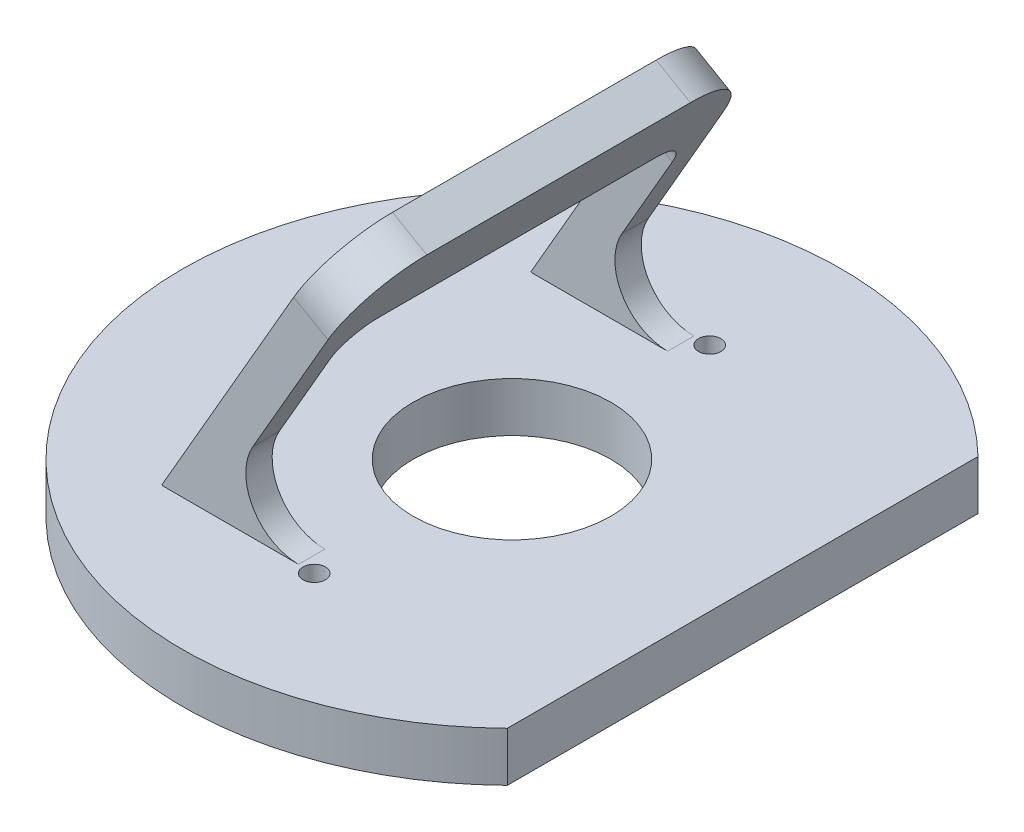
ISO-10303-21;
HEADER;
FILE_DESCRIPTION(('STEP AP214'),'2;1');
FILE_NAME('part.step','',(''),(''),'','','');
FILE_SCHEMA(('AUTOMOTIVE_DESIGN { 1 0 10303 214 1 1 1 1 }'));
ENDSEC;
DATA;
#1=APPLICATION_CONTEXT('core data for automotive mechanical design processes');
#2=APPLICATION_PROTOCOL_DEFINITION('international standard','automotive_design',2000,#1);
#3=PRODUCT_CONTEXT('',#1,'mechanical');
#4=PRODUCT('Part','Part','',(#3));
#5=PRODUCT_RELATED_PRODUCT_CATEGORY('part','',(#4));
#6=PRODUCT_DEFINITION_FORMATION('','',#4);
#7=PRODUCT_DEFINITION_CONTEXT('part definition',#1,'design');
#8=PRODUCT_DEFINITION('design','',#6,#7);
#9=PRODUCT_DEFINITION_SHAPE('','',#8);
#10=(LENGTH_UNIT() NAMED_UNIT(*) SI_UNIT(.MILLI.,.METRE.));
#11=(NAMED_UNIT(*) PLANE_ANGLE_UNIT() SI_UNIT($,.RADIAN.));
#12=(NAMED_UNIT(*) SI_UNIT($,.STERADIAN.) SOLID_ANGLE_UNIT());
#13=UNCERTAINTY_MEASURE_WITH_UNIT(LENGTH_MEASURE(1.E-05),#10,'distance_accuracy_value','');
#14=(GEOMETRIC_REPRESENTATION_CONTEXT(3) GLOBAL_UNCERTAINTY_ASSIGNED_CONTEXT((#13)) GLOBAL_UNIT_ASSIGNED_CONTEXT((#10,
#11,#12)) REPRESENTATION_CONTEXT('',''));
#15=CARTESIAN_POINT('',(0.,0.,0.));
#16=DIRECTION('',(0.,0.,1.));
#17=DIRECTION('',(1.,0.,0.));
#18=AXIS2_PLACEMENT_3D('',#15,#16,#17);
#19=CARTESIAN_POINT('',(0.,15.,0.));
#20=DIRECTION('',(0.,1.,0.));
#21=DIRECTION('',(0.,0.,1.));
#22=AXIS2_PLACEMENT_3D('',#19,#20,#21);
#23=PLANE('',#22);
#24=CARTESIAN_POINT('',(-6.28466640991764E-13,15.,-60.));
#25=DIRECTION('',(0.,1.,0.));
#26=DIRECTION('',(0.,0.,1.));
#27=AXIS2_PLACEMENT_3D('',#24,#25,#26);
#28=CIRCLE('',#27,3.39999999999999);
#29=CARTESIAN_POINT('',(-6.28466640991764E-13,15.,-56.6));
#30=VERTEX_POINT('',#29);
#31=EDGE_CURVE('E483',#30,#30,#28,.T.);
#32=ORIENTED_EDGE('',*,*,#31,.F.);
#33=EDGE_LOOP('',(#32));
#34=FACE_BOUND('',#33,.T.);
#35=CARTESIAN_POINT('',(2.09488880330588E-13,15.,60.));
#36=DIRECTION('',(0.,1.,0.));
#37=DIRECTION('',(0.,0.,1.));
#38=AXIS2_PLACEMENT_3D('',#35,#36,#37);
#39=CIRCLE('',#38,3.39999999999999);
#40=CARTESIAN_POINT('',(2.09488880330588E-13,15.,63.4));
#41=VERTEX_POINT('',#40);
#42=EDGE_CURVE('E487',#41,#41,#39,.T.);
#43=ORIENTED_EDGE('',*,*,#42,.F.);
#44=EDGE_LOOP('',(#43));
#45=FACE_BOUND('',#44,.T.);
#46=CARTESIAN_POINT('',(-60.,15.,0.));
#47=DIRECTION('',(0.,1.,0.));
#48=DIRECTION('',(0.,0.,1.));
#49=AXIS2_PLACEMENT_3D('',#46,#47,#48);
#50=CIRCLE('',#49,3.39999999999999);
#51=CARTESIAN_POINT('',(-60.,15.,3.39999999999999));
#52=VERTEX_POINT('',#51);
#53=EDGE_CURVE('E497',#52,#52,#50,.T.);
#54=ORIENTED_EDGE('',*,*,#53,.F.);
#55=EDGE_LOOP('',(#54));
#56=FACE_BOUND('',#55,.T.);
#57=DIRECTION('',(-1.,0.,0.));
#58=VECTOR('',#57,1.);
#59=CARTESIAN_POINT('',(0.,15.,52.));
#60=LINE('',#59,#58);
#61=CARTESIAN_POINT('',(-4.7705265805027,15.,52.));
#62=VERTEX_POINT('',#61);
#63=CARTESIAN_POINT('',(-45.9404015731476,15.,52.));
#64=VERTEX_POINT('',#63);
#65=EDGE_CURVE('E342',#62,#64,#60,.T.);
#66=ORIENTED_EDGE('',*,*,#65,.F.);
#67=DIRECTION('',(0.,0.,-1.));
#68=VECTOR('',#67,1.);
#69=CARTESIAN_POINT('',(-4.7705265805027,15.,60.));
#70=LINE('',#69,#68);
#71=CARTESIAN_POINT('',(-4.7705265805027,15.,60.));
#72=VERTEX_POINT('',#71);
#73=EDGE_CURVE('E360',#62,#72,#70,.F.);
#74=ORIENTED_EDGE('',*,*,#73,.T.);
#75=DIRECTION('',(1.,0.,0.));
#76=VECTOR('',#75,1.);
#77=CARTESIAN_POINT('',(0.,15.,60.));
#78=LINE('',#77,#76);
#79=CARTESIAN_POINT('',(-45.9404015731476,15.,60.));
#80=VERTEX_POINT('',#79);
#81=EDGE_CURVE('E350',#80,#72,#78,.T.);
#82=ORIENTED_EDGE('',*,*,#81,.F.);
#83=DIRECTION('',(0.,0.,1.));
#84=VECTOR('',#83,1.);
#85=CARTESIAN_POINT('',(-45.9404015731476,15.,0.));
#86=LINE('',#85,#84);
#87=EDGE_CURVE('E346',#64,#80,#86,.T.);
#88=ORIENTED_EDGE('',*,*,#87,.F.);
#89=EDGE_LOOP('',(#66,#74,#82,#88));
#90=FACE_BOUND('',#89,.T.);
#91=DIRECTION('',(-1.,0.,0.));
#92=VECTOR('',#91,1.);
#93=CARTESIAN_POINT('',(0.,15.,-60.));
#94=LINE('',#93,#92);
#95=CARTESIAN_POINT('',(-4.77052658050271,15.,-60.));
#96=VERTEX_POINT('',#95);
#97=CARTESIAN_POINT('',(-45.9404015731476,15.,-60.));
#98=VERTEX_POINT('',#97);
#99=EDGE_CURVE('E57',#96,#98,#94,.T.);
#100=ORIENTED_EDGE('',*,*,#99,.F.);
#101=DIRECTION('',(0.,0.,-1.));
#102=VECTOR('',#101,1.);
#103=CARTESIAN_POINT('',(-4.77052658050271,15.,-52.));
#104=LINE('',#103,#102);
#105=CARTESIAN_POINT('',(-4.77052658050271,15.,-52.));
#106=VERTEX_POINT('',#105);
#107=EDGE_CURVE('E364',#96,#106,#104,.F.);
#108=ORIENTED_EDGE('',*,*,#107,.T.);
#109=DIRECTION('',(1.,0.,0.));
#110=VECTOR('',#109,1.);
#111=CARTESIAN_POINT('',(0.,15.,-52.));
#112=LINE('',#111,#110);
#113=CARTESIAN_POINT('',(-45.9404015731476,15.,-52.));
#114=VERTEX_POINT('',#113);
#115=EDGE_CURVE('E65',#114,#106,#112,.T.);
#116=ORIENTED_EDGE('',*,*,#115,.F.);
#117=DIRECTION('',(0.,0.,1.));
#118=VECTOR('',#117,1.);
#119=CARTESIAN_POINT('',(-45.9404015731476,15.,0.));
#120=LINE('',#119,#118);
#121=EDGE_CURVE('E338',#98,#114,#120,.T.);
#122=ORIENTED_EDGE('',*,*,#121,.F.);
#123=EDGE_LOOP('',(#100,#108,#116,#122));
#124=FACE_BOUND('',#123,.T.);
#125=CARTESIAN_POINT('',(0.,15.,0.));
#126=DIRECTION('',(0.,1.,0.));
#127=DIRECTION('',(0.,0.,1.));
#128=AXIS2_PLACEMENT_3D('',#125,#126,#127);
#129=CIRCLE('',#128,100.);
#130=CARTESIAN_POINT('',(70.,15.,-71.4142842854285));
#131=VERTEX_POINT('',#130);
#132=CARTESIAN_POINT('',(70.,15.,71.4142842854285));
#133=VERTEX_POINT('',#132);
#134=EDGE_CURVE('E313',#131,#133,#129,.T.);
#135=ORIENTED_EDGE('',*,*,#134,.T.);
#136=DIRECTION('',(0.,0.,-1.));
#137=VECTOR('',#136,1.);
#138=CARTESIAN_POINT('',(70.,15.,-71.4142842854285));
#139=LINE('',#138,#137);
#140=EDGE_CURVE('E317',#133,#131,#139,.T.);
#141=ORIENTED_EDGE('',*,*,#140,.T.);
#142=EDGE_LOOP('',(#135,#141));
#143=FACE_BOUND('',#142,.T.);
#144=CARTESIAN_POINT('',(0.,15.,0.));
#145=DIRECTION('',(0.,1.,0.));
#146=DIRECTION('',(0.,0.,1.));
#147=AXIS2_PLACEMENT_3D('',#144,#145,#146);
#148=CIRCLE('',#147,30.);
#149=CARTESIAN_POINT('',(0.,15.,30.));
#150=VERTEX_POINT('',#149);
#151=EDGE_CURVE('E305',#150,#150,#148,.T.);
#152=ORIENTED_EDGE('',*,*,#151,.F.);
#153=EDGE_LOOP('',(#152));
#154=FACE_BOUND('',#153,.T.);
#155=ADVANCED_FACE('F41',(#34,#45,#56,#90,#124,#143,#154),#23,.T.);
#156=CARTESIAN_POINT('',(0.,0.,0.));
#157=DIRECTION('',(0.,1.,0.));
#158=DIRECTION('',(0.,0.,1.));
#159=AXIS2_PLACEMENT_3D('',#156,#157,#158);
#160=PLANE('',#159);
#161=CARTESIAN_POINT('',(-6.28466640991764E-13,0.,-60.));
#162=DIRECTION('',(0.,1.,0.));
#163=DIRECTION('',(0.,0.,1.));
#164=AXIS2_PLACEMENT_3D('',#161,#162,#163);
#165=CIRCLE('',#164,3.39999999999999);
#166=CARTESIAN_POINT('',(-6.28466640991764E-13,0.,-56.6));
#167=VERTEX_POINT('',#166);
#168=EDGE_CURVE('E481',#167,#167,#165,.T.);
#169=ORIENTED_EDGE('',*,*,#168,.T.);
#170=EDGE_LOOP('',(#169));
#171=FACE_BOUND('',#170,.T.);
#172=CARTESIAN_POINT('',(2.09488880330588E-13,0.,60.));
#173=DIRECTION('',(0.,1.,0.));
#174=DIRECTION('',(0.,0.,1.));
#175=AXIS2_PLACEMENT_3D('',#172,#173,#174);
#176=CIRCLE('',#175,3.39999999999999);
#177=CARTESIAN_POINT('',(2.09488880330588E-13,0.,63.4));
#178=VERTEX_POINT('',#177);
#179=EDGE_CURVE('E493',#178,#178,#176,.T.);
#180=ORIENTED_EDGE('',*,*,#179,.T.);
#181=EDGE_LOOP('',(#180));
#182=FACE_BOUND('',#181,.T.);
#183=CARTESIAN_POINT('',(-60.,0.,0.));
#184=DIRECTION('',(0.,1.,0.));
#185=DIRECTION('',(0.,0.,1.));
#186=AXIS2_PLACEMENT_3D('',#183,#184,#185);
#187=CIRCLE('',#186,3.39999999999999);
#188=CARTESIAN_POINT('',(-60.,0.,3.39999999999999));
#189=VERTEX_POINT('',#188);
#190=EDGE_CURVE('E233',#189,#189,#187,.T.);
#191=ORIENTED_EDGE('',*,*,#190,.T.);
#192=EDGE_LOOP('',(#191));
#193=FACE_BOUND('',#192,.T.);
#194=CARTESIAN_POINT('',(0.,0.,0.));
#195=DIRECTION('',(0.,1.,0.));
#196=DIRECTION('',(0.,0.,1.));
#197=AXIS2_PLACEMENT_3D('',#194,#195,#196);
#198=CIRCLE('',#197,100.);
#199=CARTESIAN_POINT('',(70.,0.,-71.4142842854285));
#200=VERTEX_POINT('',#199);
#201=CARTESIAN_POINT('',(70.,0.,71.4142842854285));
#202=VERTEX_POINT('',#201);
#203=EDGE_CURVE('E309',#200,#202,#198,.T.);
#204=ORIENTED_EDGE('',*,*,#203,.F.);
#205=DIRECTION('',(0.,0.,-1.));
#206=VECTOR('',#205,1.);
#207=CARTESIAN_POINT('',(70.,0.,-71.4142842854285));
#208=LINE('',#207,#206);
#209=EDGE_CURVE('E318',#202,#200,#208,.T.);
#210=ORIENTED_EDGE('',*,*,#209,.F.);
#211=EDGE_LOOP('',(#204,#210));
#212=FACE_BOUND('',#211,.T.);
#213=CARTESIAN_POINT('',(0.,0.,0.));
#214=DIRECTION('',(0.,1.,0.));
#215=DIRECTION('',(0.,0.,1.));
#216=AXIS2_PLACEMENT_3D('',#213,#214,#215);
#217=CIRCLE('',#216,30.);
#218=CARTESIAN_POINT('',(0.,0.,30.));
#219=VERTEX_POINT('',#218);
#220=EDGE_CURVE('E276',#219,#219,#217,.T.);
#221=ORIENTED_EDGE('',*,*,#220,.T.);
#222=EDGE_LOOP('',(#221));
#223=FACE_BOUND('',#222,.T.);
#224=ADVANCED_FACE('F433',(#171,#182,#193,#212,#223),#160,.F.);
#225=CARTESIAN_POINT('',(0.,15.,0.));
#226=DIRECTION('',(0.,-1.,0.));
#227=DIRECTION('',(0.,0.,-1.));
#228=AXIS2_PLACEMENT_3D('',#225,#226,#227);
#229=CYLINDRICAL_SURFACE('',#228,100.);
#230=ORIENTED_EDGE('',*,*,#203,.T.);
#231=DIRECTION('',(0.,-1.,0.));
#232=VECTOR('',#231,1.);
#233=CARTESIAN_POINT('',(70.,15.,71.4142842854285));
#234=LINE('',#233,#232);
#235=EDGE_CURVE('E330',#133,#202,#234,.T.);
#236=ORIENTED_EDGE('',*,*,#235,.F.);
#237=ORIENTED_EDGE('',*,*,#134,.F.);
#238=DIRECTION('',(0.,-1.,0.));
#239=VECTOR('',#238,1.);
#240=CARTESIAN_POINT('',(70.,15.,-71.4142842854285));
#241=LINE('',#240,#239);
#242=EDGE_CURVE('E321',#131,#200,#241,.T.);
#243=ORIENTED_EDGE('',*,*,#242,.T.);
#244=EDGE_LOOP('',(#230,#236,#237,#243));
#245=FACE_BOUND('',#244,.T.);
#246=ADVANCED_FACE('F439',(#245),#229,.T.);
#247=CARTESIAN_POINT('',(70.,15.,-71.4142842854285));
#248=DIRECTION('',(-1.,0.,0.));
#249=DIRECTION('',(0.,0.,1.));
#250=AXIS2_PLACEMENT_3D('',#247,#248,#249);
#251=PLANE('',#250);
#252=ORIENTED_EDGE('',*,*,#209,.T.);
#253=ORIENTED_EDGE('',*,*,#242,.F.);
#254=ORIENTED_EDGE('',*,*,#140,.F.);
#255=ORIENTED_EDGE('',*,*,#235,.T.);
#256=EDGE_LOOP('',(#252,#253,#254,#255));
#257=FACE_BOUND('',#256,.T.);
#258=ADVANCED_FACE('F448',(#257),#251,.F.);
#259=CARTESIAN_POINT('',(0.,15.,0.));
#260=DIRECTION('',(0.,-1.,0.));
#261=DIRECTION('',(0.,0.,-1.));
#262=AXIS2_PLACEMENT_3D('',#259,#260,#261);
#263=CYLINDRICAL_SURFACE('',#262,30.);
#264=ORIENTED_EDGE('',*,*,#151,.T.);
#265=EDGE_LOOP('',(#264));
#266=FACE_BOUND('',#265,.T.);
#267=ORIENTED_EDGE('',*,*,#220,.F.);
#268=EDGE_LOOP('',(#267));
#269=FACE_BOUND('',#268,.T.);
#270=ADVANCED_FACE('F445',(#266,#269),#263,.F.);
#271=CARTESIAN_POINT('',(-35.8476050194904,9.17292119286991,-60.));
#272=DIRECTION('',(-0.499999999999998,-0.86602540378444,0.));
#273=DIRECTION('',(0.86602540378444,-0.499999999999998,0.));
#274=AXIS2_PLACEMENT_3D('',#271,#272,#273);
#275=PLANE('',#274);
#276=DIRECTION('',(-0.86602540378444,0.499999999999998,0.));
#277=VECTOR('',#276,1.);
#278=CARTESIAN_POINT('',(-35.8476050194904,9.17292119286991,-60.));
#279=LINE('',#278,#277);
#280=CARTESIAN_POINT('',(-46.2399098649037,15.1729211928699,-60.));
#281=VERTEX_POINT('',#280);
#282=EDGE_CURVE('E273',#98,#281,#279,.T.);
#283=ORIENTED_EDGE('',*,*,#282,.F.);
#284=ORIENTED_EDGE('',*,*,#121,.T.);
#285=DIRECTION('',(-0.86602540378444,0.499999999999998,0.));
#286=VECTOR('',#285,1.);
#287=CARTESIAN_POINT('',(-35.8476050194904,9.17292119286991,-52.));
#288=LINE('',#287,#286);
#289=CARTESIAN_POINT('',(-46.2399098649037,15.1729211928699,-52.));
#290=VERTEX_POINT('',#289);
#291=EDGE_CURVE('E188',#114,#290,#288,.T.);
#292=ORIENTED_EDGE('',*,*,#291,.T.);
#293=DIRECTION('',(0.,0.,1.));
#294=VECTOR('',#293,1.);
#295=CARTESIAN_POINT('',(-46.2399098649037,15.1729211928699,-60.));
#296=LINE('',#295,#294);
#297=EDGE_CURVE('E228',#281,#290,#296,.T.);
#298=ORIENTED_EDGE('',*,*,#297,.F.);
#299=EDGE_LOOP('',(#283,#284,#292,#298));
#300=FACE_BOUND('',#299,.T.);
#301=ADVANCED_FACE('F404',(#300),#275,.T.);
#302=CARTESIAN_POINT('',(-35.8476050194904,9.17292119286991,-60.));
#303=DIRECTION('',(0.,0.,-1.));
#304=DIRECTION('',(-1.,0.,0.));
#305=AXIS2_PLACEMENT_3D('',#302,#303,#304);
#306=PLANE('',#305);
#307=DIRECTION('',(-0.499999999999998,-0.86602540378444,0.));
#308=VECTOR('',#307,1.);
#309=CARTESIAN_POINT('',(-35.8476050194904,9.17292119286991,-60.));
#310=LINE('',#309,#308);
#311=CARTESIAN_POINT('',(4.1523949805094,78.454953495625,-60.));
#312=VERTEX_POINT('',#311);
#313=CARTESIAN_POINT('',(-18.6269330410537,39.,-60.));
#314=VERTEX_POINT('',#313);
#315=EDGE_CURVE('E224',#312,#314,#310,.T.);
#316=ORIENTED_EDGE('',*,*,#315,.T.);
#317=CARTESIAN_POINT('',(-4.77052658050271,31.,-60.));
#318=DIRECTION('',(0.,0.,-1.));
#319=DIRECTION('',(-1.,0.,0.));
#320=AXIS2_PLACEMENT_3D('',#317,#318,#319);
#321=CIRCLE('',#320,16.);
#322=EDGE_CURVE('E367',#314,#96,#321,.F.);
#323=ORIENTED_EDGE('',*,*,#322,.T.);
#324=ORIENTED_EDGE('',*,*,#99,.T.);
#325=ORIENTED_EDGE('',*,*,#282,.T.);
#326=DIRECTION('',(-0.499999999999998,-0.86602540378444,0.));
#327=VECTOR('',#326,1.);
#328=CARTESIAN_POINT('',(-46.2399098649037,15.1729211928699,-60.));
#329=LINE('',#328,#327);
#330=CARTESIAN_POINT('',(-6.23990986490388,84.454953495625,-60.));
#331=VERTEX_POINT('',#330);
#332=EDGE_CURVE('E178',#331,#281,#329,.T.);
#333=ORIENTED_EDGE('',*,*,#332,.F.);
#334=DIRECTION('',(-0.86602540378444,0.499999999999998,0.));
#335=VECTOR('',#334,1.);
#336=CARTESIAN_POINT('',(4.1523949805094,78.454953495625,-60.));
#337=LINE('',#336,#335);
#338=EDGE_CURVE('E277',#312,#331,#337,.T.);
#339=ORIENTED_EDGE('',*,*,#338,.F.);
#340=EDGE_LOOP('',(#316,#323,#324,#325,#333,#339));
#341=FACE_BOUND('',#340,.T.);
#342=ADVANCED_FACE('F407',(#341),#306,.T.);
#343=CARTESIAN_POINT('',(4.15239498050947,78.4549534956251,-40.));
#344=DIRECTION('',(-0.86602540378444,0.499999999999998,0.));
#345=DIRECTION('',(-0.499999999999998,-0.86602540378444,0.));
#346=AXIS2_PLACEMENT_3D('',#343,#344,#345);
#347=CYLINDRICAL_SURFACE('',#346,20.);
#348=CARTESIAN_POINT('',(-6.2399098649038,84.4549534956251,-40.));
#349=DIRECTION('',(-0.86602540378444,0.499999999999998,0.));
#350=DIRECTION('',(0.499999999999998,0.86602540378444,0.));
#351=AXIS2_PLACEMENT_3D('',#348,#349,#350);
#352=CIRCLE('',#351,20.);
#353=CARTESIAN_POINT('',(3.76009013509615,101.775461571314,-40.));
#354=VERTEX_POINT('',#353);
#355=EDGE_CURVE('E266',#354,#331,#352,.T.);
#356=ORIENTED_EDGE('',*,*,#355,.F.);
#357=DIRECTION('',(-0.86602540378444,0.499999999999998,0.));
#358=VECTOR('',#357,1.);
#359=CARTESIAN_POINT('',(14.1523949805094,95.7754615713139,-40.));
#360=LINE('',#359,#358);
#361=CARTESIAN_POINT('',(14.1523949805094,95.7754615713139,-40.));
#362=VERTEX_POINT('',#361);
#363=EDGE_CURVE('E280',#362,#354,#360,.T.);
#364=ORIENTED_EDGE('',*,*,#363,.F.);
#365=CARTESIAN_POINT('',(4.15239498050947,78.4549534956251,-40.));
#366=DIRECTION('',(-0.86602540378444,0.499999999999998,0.));
#367=DIRECTION('',(0.499999999999998,0.86602540378444,0.));
#368=AXIS2_PLACEMENT_3D('',#365,#366,#367);
#369=CIRCLE('',#368,20.);
#370=EDGE_CURVE('E220',#362,#312,#369,.T.);
#371=ORIENTED_EDGE('',*,*,#370,.T.);
#372=ORIENTED_EDGE('',*,*,#338,.T.);
#373=EDGE_LOOP('',(#356,#364,#371,#372));
#374=FACE_BOUND('',#373,.T.);
#375=ADVANCED_FACE('F423',(#374),#347,.T.);
#376=CARTESIAN_POINT('',(14.1523949805094,95.7754615713139,-39.9999999999999));
#377=DIRECTION('',(0.499999999999998,0.86602540378444,0.));
#378=DIRECTION('',(-0.86602540378444,0.499999999999998,0.));
#379=AXIS2_PLACEMENT_3D('',#376,#377,#378);
#380=PLANE('',#379);
#381=DIRECTION('',(0.,0.,-1.));
#382=VECTOR('',#381,1.);
#383=CARTESIAN_POINT('',(3.76009013509615,101.775461571314,-39.9999999999999));
#384=LINE('',#383,#382);
#385=CARTESIAN_POINT('',(3.76009013509616,101.775461571314,39.9999999999999));
#386=VERTEX_POINT('',#385);
#387=EDGE_CURVE('E262',#386,#354,#384,.T.);
#388=ORIENTED_EDGE('',*,*,#387,.F.);
#389=DIRECTION('',(-0.86602540378444,0.499999999999998,0.));
#390=VECTOR('',#389,1.);
#391=CARTESIAN_POINT('',(14.1523949805094,95.7754615713139,39.9999999999999));
#392=LINE('',#391,#390);
#393=CARTESIAN_POINT('',(14.1523949805094,95.7754615713139,39.9999999999999));
#394=VERTEX_POINT('',#393);
#395=EDGE_CURVE('E283',#394,#386,#392,.T.);
#396=ORIENTED_EDGE('',*,*,#395,.F.);
#397=DIRECTION('',(0.,0.,-1.));
#398=VECTOR('',#397,1.);
#399=CARTESIAN_POINT('',(14.1523949805094,95.7754615713139,-39.9999999999999));
#400=LINE('',#399,#398);
#401=EDGE_CURVE('E216',#394,#362,#400,.T.);
#402=ORIENTED_EDGE('',*,*,#401,.T.);
#403=ORIENTED_EDGE('',*,*,#363,.T.);
#404=EDGE_LOOP('',(#388,#396,#402,#403));
#405=FACE_BOUND('',#404,.T.);
#406=ADVANCED_FACE('F419',(#405),#380,.T.);
#407=CARTESIAN_POINT('',(4.15239498050949,78.4549534956251,40.));
#408=DIRECTION('',(-0.86602540378444,0.499999999999998,0.));
#409=DIRECTION('',(-0.499999999999998,-0.86602540378444,0.));
#410=AXIS2_PLACEMENT_3D('',#407,#408,#409);
#411=CYLINDRICAL_SURFACE('',#410,20.);
#412=CARTESIAN_POINT('',(-6.23990986490379,84.4549534956251,40.));
#413=DIRECTION('',(-0.86602540378444,0.499999999999998,0.));
#414=DIRECTION('',(-0.499999999999998,-0.86602540378444,0.));
#415=AXIS2_PLACEMENT_3D('',#412,#413,#414);
#416=CIRCLE('',#415,20.);
#417=CARTESIAN_POINT('',(-6.23990986490386,84.454953495625,60.));
#418=VERTEX_POINT('',#417);
#419=EDGE_CURVE('E258',#418,#386,#416,.T.);
#420=ORIENTED_EDGE('',*,*,#419,.F.);
#421=DIRECTION('',(-0.86602540378444,0.499999999999998,0.));
#422=VECTOR('',#421,1.);
#423=CARTESIAN_POINT('',(4.15239498050942,78.454953495625,60.));
#424=LINE('',#423,#422);
#425=CARTESIAN_POINT('',(4.15239498050942,78.454953495625,60.));
#426=VERTEX_POINT('',#425);
#427=EDGE_CURVE('E286',#426,#418,#424,.T.);
#428=ORIENTED_EDGE('',*,*,#427,.F.);
#429=CARTESIAN_POINT('',(4.15239498050949,78.4549534956251,40.));
#430=DIRECTION('',(-0.86602540378444,0.499999999999998,0.));
#431=DIRECTION('',(-0.499999999999998,-0.86602540378444,0.));
#432=AXIS2_PLACEMENT_3D('',#429,#430,#431);
#433=CIRCLE('',#432,20.);
#434=EDGE_CURVE('E212',#426,#394,#433,.T.);
#435=ORIENTED_EDGE('',*,*,#434,.T.);
#436=ORIENTED_EDGE('',*,*,#395,.T.);
#437=EDGE_LOOP('',(#420,#428,#435,#436));
#438=FACE_BOUND('',#437,.T.);
#439=ADVANCED_FACE('F422',(#438),#411,.T.);
#440=CARTESIAN_POINT('',(-35.8476050194904,9.17292119286991,60.));
#441=DIRECTION('',(0.,0.,1.));
#442=DIRECTION('',(1.,0.,0.));
#443=AXIS2_PLACEMENT_3D('',#440,#441,#442);
#444=PLANE('',#443);
#445=DIRECTION('',(-0.86602540378444,0.499999999999998,0.));
#446=VECTOR('',#445,1.);
#447=CARTESIAN_POINT('',(-35.8476050194904,9.17292119286991,60.));
#448=LINE('',#447,#446);
#449=CARTESIAN_POINT('',(-46.2399098649036,15.1729211928699,60.));
#450=VERTEX_POINT('',#449);
#451=EDGE_CURVE('E289',#80,#450,#448,.T.);
#452=ORIENTED_EDGE('',*,*,#451,.F.);
#453=ORIENTED_EDGE('',*,*,#81,.T.);
#454=CARTESIAN_POINT('',(-4.7705265805027,31.,60.));
#455=DIRECTION('',(0.,0.,1.));
#456=DIRECTION('',(1.,0.,0.));
#457=AXIS2_PLACEMENT_3D('',#454,#455,#456);
#458=CIRCLE('',#457,16.);
#459=CARTESIAN_POINT('',(-18.6269330410537,39.,60.));
#460=VERTEX_POINT('',#459);
#461=EDGE_CURVE('E11',#72,#460,#458,.F.);
#462=ORIENTED_EDGE('',*,*,#461,.T.);
#463=DIRECTION('',(0.499999999999998,0.86602540378444,0.));
#464=VECTOR('',#463,1.);
#465=CARTESIAN_POINT('',(-35.8476050194904,9.17292119286991,60.));
#466=LINE('',#465,#464);
#467=EDGE_CURVE('E209',#460,#426,#466,.T.);
#468=ORIENTED_EDGE('',*,*,#467,.T.);
#469=ORIENTED_EDGE('',*,*,#427,.T.);
#470=DIRECTION('',(0.499999999999998,0.86602540378444,0.));
#471=VECTOR('',#470,1.);
#472=CARTESIAN_POINT('',(-46.2399098649036,15.1729211928699,60.));
#473=LINE('',#472,#471);
#474=EDGE_CURVE('E254',#450,#418,#473,.T.);
#475=ORIENTED_EDGE('',*,*,#474,.F.);
#476=EDGE_LOOP('',(#452,#453,#462,#468,#469,#475));
#477=FACE_BOUND('',#476,.T.);
#478=ADVANCED_FACE('F388',(#477),#444,.T.);
#479=CARTESIAN_POINT('',(-35.8476050194904,9.17292119286991,60.));
#480=DIRECTION('',(-0.499999999999998,-0.86602540378444,0.));
#481=DIRECTION('',(0.86602540378444,-0.499999999999998,0.));
#482=AXIS2_PLACEMENT_3D('',#479,#480,#481);
#483=PLANE('',#482);
#484=DIRECTION('',(-0.86602540378444,0.499999999999998,0.));
#485=VECTOR('',#484,1.);
#486=CARTESIAN_POINT('',(-35.8476050194904,9.17292119286991,52.));
#487=LINE('',#486,#485);
#488=CARTESIAN_POINT('',(-46.2399098649036,15.1729211928699,52.));
#489=VERTEX_POINT('',#488);
#490=EDGE_CURVE('E292',#64,#489,#487,.T.);
#491=ORIENTED_EDGE('',*,*,#490,.F.);
#492=ORIENTED_EDGE('',*,*,#87,.T.);
#493=ORIENTED_EDGE('',*,*,#451,.T.);
#494=DIRECTION('',(0.,0.,1.));
#495=VECTOR('',#494,1.);
#496=CARTESIAN_POINT('',(-46.2399098649036,15.1729211928699,60.));
#497=LINE('',#496,#495);
#498=EDGE_CURVE('E250',#489,#450,#497,.T.);
#499=ORIENTED_EDGE('',*,*,#498,.F.);
#500=EDGE_LOOP('',(#491,#492,#493,#499));
#501=FACE_BOUND('',#500,.T.);
#502=ADVANCED_FACE('F384',(#501),#483,.T.);
#503=CARTESIAN_POINT('',(-35.8476050194904,9.17292119286991,52.));
#504=DIRECTION('',(0.,0.,-1.));
#505=DIRECTION('',(-1.,0.,0.));
#506=AXIS2_PLACEMENT_3D('',#503,#504,#505);
#507=PLANE('',#506);
#508=DIRECTION('',(-0.499999999999998,-0.86602540378444,0.));
#509=VECTOR('',#508,1.);
#510=CARTESIAN_POINT('',(-35.8476050194904,9.17292119286991,52.));
#511=LINE('',#510,#509);
#512=CARTESIAN_POINT('',(-3.34760501949053,65.4645724388584,52.));
#513=VERTEX_POINT('',#512);
#514=CARTESIAN_POINT('',(-18.6269330410537,39.,52.));
#515=VERTEX_POINT('',#514);
#516=EDGE_CURVE('E205',#513,#515,#511,.T.);
#517=ORIENTED_EDGE('',*,*,#516,.T.);
#518=CARTESIAN_POINT('',(-4.7705265805027,31.,52.));
#519=DIRECTION('',(0.,0.,-1.));
#520=DIRECTION('',(-1.,0.,0.));
#521=AXIS2_PLACEMENT_3D('',#518,#519,#520);
#522=CIRCLE('',#521,16.);
#523=EDGE_CURVE('E50',#515,#62,#522,.F.);
#524=ORIENTED_EDGE('',*,*,#523,.T.);
#525=ORIENTED_EDGE('',*,*,#65,.T.);
#526=ORIENTED_EDGE('',*,*,#490,.T.);
#527=DIRECTION('',(-0.499999999999998,-0.86602540378444,0.));
#528=VECTOR('',#527,1.);
#529=CARTESIAN_POINT('',(-46.2399098649036,15.1729211928699,52.));
#530=LINE('',#529,#528);
#531=CARTESIAN_POINT('',(-13.7399098649038,71.4645724388584,52.));
#532=VERTEX_POINT('',#531);
#533=EDGE_CURVE('E246',#532,#489,#530,.T.);
#534=ORIENTED_EDGE('',*,*,#533,.F.);
#535=DIRECTION('',(-0.86602540378444,0.499999999999998,0.));
#536=VECTOR('',#535,1.);
#537=CARTESIAN_POINT('',(-3.34760501949053,65.4645724388584,52.));
#538=LINE('',#537,#536);
#539=EDGE_CURVE('E295',#513,#532,#538,.T.);
#540=ORIENTED_EDGE('',*,*,#539,.F.);
#541=EDGE_LOOP('',(#517,#524,#525,#526,#534,#540));
#542=FACE_BOUND('',#541,.T.);
#543=ADVANCED_FACE('F375',(#542),#507,.T.);
#544=CARTESIAN_POINT('',(-3.3476050194905,65.4645724388585,42.));
#545=DIRECTION('',(-0.86602540378444,0.499999999999998,0.));
#546=DIRECTION('',(-0.499999999999998,-0.86602540378444,0.));
#547=AXIS2_PLACEMENT_3D('',#544,#545,#546);
#548=CYLINDRICAL_SURFACE('',#547,10.);
#549=CARTESIAN_POINT('',(-13.7399098649038,71.4645724388585,42.));
#550=DIRECTION('',(0.86602540378444,-0.499999999999998,0.));
#551=DIRECTION('',(-0.499999999999998,-0.86602540378444,0.));
#552=AXIS2_PLACEMENT_3D('',#549,#550,#551);
#553=CIRCLE('',#552,10.);
#554=CARTESIAN_POINT('',(-8.7399098649038,80.1248264767029,41.9999999999999));
#555=VERTEX_POINT('',#554);
#556=EDGE_CURVE('E242',#555,#532,#553,.T.);
#557=ORIENTED_EDGE('',*,*,#556,.F.);
#558=DIRECTION('',(-0.86602540378444,0.499999999999998,0.));
#559=VECTOR('',#558,1.);
#560=CARTESIAN_POINT('',(1.65239498050948,74.1248264767029,41.9999999999999));
#561=LINE('',#560,#559);
#562=CARTESIAN_POINT('',(1.65239498050948,74.1248264767029,41.9999999999999));
#563=VERTEX_POINT('',#562);
#564=EDGE_CURVE('E298',#563,#555,#561,.T.);
#565=ORIENTED_EDGE('',*,*,#564,.F.);
#566=CARTESIAN_POINT('',(-3.3476050194905,65.4645724388585,42.));
#567=DIRECTION('',(0.86602540378444,-0.499999999999998,0.));
#568=DIRECTION('',(-0.499999999999998,-0.86602540378444,0.));
#569=AXIS2_PLACEMENT_3D('',#566,#567,#568);
#570=CIRCLE('',#569,10.);
#571=EDGE_CURVE('E198',#563,#513,#570,.T.);
#572=ORIENTED_EDGE('',*,*,#571,.T.);
#573=ORIENTED_EDGE('',*,*,#539,.T.);
#574=EDGE_LOOP('',(#557,#565,#572,#573));
#575=FACE_BOUND('',#574,.T.);
#576=ADVANCED_FACE('F397',(#575),#548,.F.);
#577=CARTESIAN_POINT('',(1.65239498050947,74.1248264767029,-41.9999999999999));
#578=DIRECTION('',(-0.499999999999998,-0.86602540378444,0.));
#579=DIRECTION('',(0.86602540378444,-0.499999999999998,0.));
#580=AXIS2_PLACEMENT_3D('',#577,#578,#579);
#581=PLANE('',#580);
#582=DIRECTION('',(0.,0.,1.));
#583=VECTOR('',#582,1.);
#584=CARTESIAN_POINT('',(-8.7399098649038,80.1248264767029,-41.9999999999999));
#585=LINE('',#584,#583);
#586=CARTESIAN_POINT('',(-8.7399098649038,80.1248264767029,-41.9999999999999));
#587=VERTEX_POINT('',#586);
#588=EDGE_CURVE('E238',#587,#555,#585,.T.);
#589=ORIENTED_EDGE('',*,*,#588,.F.);
#590=DIRECTION('',(-0.86602540378444,0.499999999999998,0.));
#591=VECTOR('',#590,1.);
#592=CARTESIAN_POINT('',(1.65239498050947,74.1248264767029,-41.9999999999999));
#593=LINE('',#592,#591);
#594=CARTESIAN_POINT('',(1.65239498050947,74.1248264767029,-41.9999999999999));
#595=VERTEX_POINT('',#594);
#596=EDGE_CURVE('E187',#595,#587,#593,.T.);
#597=ORIENTED_EDGE('',*,*,#596,.F.);
#598=DIRECTION('',(0.,0.,1.));
#599=VECTOR('',#598,1.);
#600=CARTESIAN_POINT('',(1.65239498050947,74.1248264767029,-41.9999999999999));
#601=LINE('',#600,#599);
#602=EDGE_CURVE('E194',#595,#563,#601,.T.);
#603=ORIENTED_EDGE('',*,*,#602,.T.);
#604=ORIENTED_EDGE('',*,*,#564,.T.);
#605=EDGE_LOOP('',(#589,#597,#603,#604));
#606=FACE_BOUND('',#605,.T.);
#607=ADVANCED_FACE('F400',(#606),#581,.T.);
#608=CARTESIAN_POINT('',(-3.3476050194905,65.4645724388585,-42.));
#609=DIRECTION('',(-0.86602540378444,0.499999999999998,0.));
#610=DIRECTION('',(-0.499999999999998,-0.86602540378444,0.));
#611=AXIS2_PLACEMENT_3D('',#608,#609,#610);
#612=CYLINDRICAL_SURFACE('',#611,10.);
#613=CARTESIAN_POINT('',(-13.7399098649038,71.4645724388585,-42.));
#614=DIRECTION('',(0.86602540378444,-0.499999999999998,0.));
#615=DIRECTION('',(0.499999999999998,0.86602540378444,0.));
#616=AXIS2_PLACEMENT_3D('',#613,#614,#615);
#617=CIRCLE('',#616,10.);
#618=CARTESIAN_POINT('',(-13.7399098649038,71.4645724388584,-52.));
#619=VERTEX_POINT('',#618);
#620=EDGE_CURVE('E184',#619,#587,#617,.T.);
#621=ORIENTED_EDGE('',*,*,#620,.F.);
#622=DIRECTION('',(-0.86602540378444,0.499999999999998,0.));
#623=VECTOR('',#622,1.);
#624=CARTESIAN_POINT('',(-3.34760501949054,65.4645724388584,-52.));
#625=LINE('',#624,#623);
#626=CARTESIAN_POINT('',(-3.34760501949054,65.4645724388584,-52.));
#627=VERTEX_POINT('',#626);
#628=EDGE_CURVE('E168',#627,#619,#625,.T.);
#629=ORIENTED_EDGE('',*,*,#628,.F.);
#630=CARTESIAN_POINT('',(-3.3476050194905,65.4645724388585,-42.));
#631=DIRECTION('',(0.86602540378444,-0.499999999999998,0.));
#632=DIRECTION('',(0.499999999999998,0.86602540378444,0.));
#633=AXIS2_PLACEMENT_3D('',#630,#631,#632);
#634=CIRCLE('',#633,10.);
#635=EDGE_CURVE('E177',#627,#595,#634,.T.);
#636=ORIENTED_EDGE('',*,*,#635,.T.);
#637=ORIENTED_EDGE('',*,*,#596,.T.);
#638=EDGE_LOOP('',(#621,#629,#636,#637));
#639=FACE_BOUND('',#638,.T.);
#640=ADVANCED_FACE('F182',(#639),#612,.F.);
#641=CARTESIAN_POINT('',(-35.8476050194904,9.17292119286991,-52.));
#642=DIRECTION('',(0.,0.,1.));
#643=DIRECTION('',(1.,0.,0.));
#644=AXIS2_PLACEMENT_3D('',#641,#642,#643);
#645=PLANE('',#644);
#646=ORIENTED_EDGE('',*,*,#291,.F.);
#647=ORIENTED_EDGE('',*,*,#115,.T.);
#648=CARTESIAN_POINT('',(-4.77052658050271,31.,-52.));
#649=DIRECTION('',(0.,0.,1.));
#650=DIRECTION('',(1.,0.,0.));
#651=AXIS2_PLACEMENT_3D('',#648,#649,#650);
#652=CIRCLE('',#651,16.);
#653=CARTESIAN_POINT('',(-18.6269330410537,39.,-52.));
#654=VERTEX_POINT('',#653);
#655=EDGE_CURVE('E171',#106,#654,#652,.F.);
#656=ORIENTED_EDGE('',*,*,#655,.T.);
#657=DIRECTION('',(0.499999999999998,0.86602540378444,0.));
#658=VECTOR('',#657,1.);
#659=CARTESIAN_POINT('',(-35.8476050194904,9.17292119286991,-52.));
#660=LINE('',#659,#658);
#661=EDGE_CURVE('E164',#654,#627,#660,.T.);
#662=ORIENTED_EDGE('',*,*,#661,.T.);
#663=ORIENTED_EDGE('',*,*,#628,.T.);
#664=DIRECTION('',(0.499999999999998,0.86602540378444,0.));
#665=VECTOR('',#664,1.);
#666=CARTESIAN_POINT('',(-46.2399098649037,15.1729211928699,-52.));
#667=LINE('',#666,#665);
#668=EDGE_CURVE('E232',#290,#619,#667,.T.);
#669=ORIENTED_EDGE('',*,*,#668,.F.);
#670=EDGE_LOOP('',(#646,#647,#656,#662,#663,#669));
#671=FACE_BOUND('',#670,.T.);
#672=ADVANCED_FACE('F166',(#671),#645,.T.);
#673=CARTESIAN_POINT('',(-3.3476050194905,65.4645724388585,-42.));
#674=DIRECTION('',(0.86602540378444,-0.499999999999998,0.));
#675=DIRECTION('',(0.499999999999998,0.86602540378444,0.));
#676=AXIS2_PLACEMENT_3D('',#673,#674,#675);
#677=PLANE('',#676);
#678=ORIENTED_EDGE('',*,*,#661,.F.);
#679=DIRECTION('',(0.,0.,-1.));
#680=VECTOR('',#679,1.);
#681=CARTESIAN_POINT('',(-18.6269330410537,39.,-60.));
#682=LINE('',#681,#680);
#683=EDGE_CURVE('E357',#654,#314,#682,.T.);
#684=ORIENTED_EDGE('',*,*,#683,.T.);
#685=ORIENTED_EDGE('',*,*,#315,.F.);
#686=ORIENTED_EDGE('',*,*,#370,.F.);
#687=ORIENTED_EDGE('',*,*,#401,.F.);
#688=ORIENTED_EDGE('',*,*,#434,.F.);
#689=ORIENTED_EDGE('',*,*,#467,.F.);
#690=DIRECTION('',(0.,0.,-1.));
#691=VECTOR('',#690,1.);
#692=CARTESIAN_POINT('',(-18.6269330410537,39.,52.));
#693=LINE('',#692,#691);
#694=EDGE_CURVE('E353',#460,#515,#693,.T.);
#695=ORIENTED_EDGE('',*,*,#694,.T.);
#696=ORIENTED_EDGE('',*,*,#516,.F.);
#697=ORIENTED_EDGE('',*,*,#571,.F.);
#698=ORIENTED_EDGE('',*,*,#602,.F.);
#699=ORIENTED_EDGE('',*,*,#635,.F.);
#700=EDGE_LOOP('',(#678,#684,#685,#686,#687,#688,#689,#695,#696,#697,#698,#699));
#701=FACE_BOUND('',#700,.T.);
#702=ADVANCED_FACE('F191',(#701),#677,.T.);
#703=CARTESIAN_POINT('',(-13.7399098649038,71.4645724388585,-42.));
#704=DIRECTION('',(0.86602540378444,-0.499999999999998,0.));
#705=DIRECTION('',(0.499999999999998,0.86602540378444,0.));
#706=AXIS2_PLACEMENT_3D('',#703,#704,#705);
#707=PLANE('',#706);
#708=ORIENTED_EDGE('',*,*,#297,.T.);
#709=ORIENTED_EDGE('',*,*,#668,.T.);
#710=ORIENTED_EDGE('',*,*,#620,.T.);
#711=ORIENTED_EDGE('',*,*,#588,.T.);
#712=ORIENTED_EDGE('',*,*,#556,.T.);
#713=ORIENTED_EDGE('',*,*,#533,.T.);
#714=ORIENTED_EDGE('',*,*,#498,.T.);
#715=ORIENTED_EDGE('',*,*,#474,.T.);
#716=ORIENTED_EDGE('',*,*,#419,.T.);
#717=ORIENTED_EDGE('',*,*,#387,.T.);
#718=ORIENTED_EDGE('',*,*,#355,.T.);
#719=ORIENTED_EDGE('',*,*,#332,.T.);
#720=EDGE_LOOP('',(#708,#709,#710,#711,#712,#713,#714,#715,#716,#717,#718,#719));
#721=FACE_BOUND('',#720,.T.);
#722=ADVANCED_FACE('F392',(#721),#707,.F.);
#723=CARTESIAN_POINT('',(-4.77052658050271,31.,-42.));
#724=DIRECTION('',(0.,0.,1.));
#725=DIRECTION('',(1.,0.,0.));
#726=AXIS2_PLACEMENT_3D('',#723,#724,#725);
#727=CYLINDRICAL_SURFACE('',#726,16.);
#728=ORIENTED_EDGE('',*,*,#655,.F.);
#729=ORIENTED_EDGE('',*,*,#107,.F.);
#730=ORIENTED_EDGE('',*,*,#322,.F.);
#731=ORIENTED_EDGE('',*,*,#683,.F.);
#732=EDGE_LOOP('',(#728,#729,#730,#731));
#733=FACE_BOUND('',#732,.T.);
#734=ADVANCED_FACE('F412',(#733),#727,.F.);
#735=CARTESIAN_POINT('',(-4.77052658050271,31.,-42.));
#736=DIRECTION('',(0.,0.,1.));
#737=DIRECTION('',(1.,0.,0.));
#738=AXIS2_PLACEMENT_3D('',#735,#736,#737);
#739=CYLINDRICAL_SURFACE('',#738,16.);
#740=ORIENTED_EDGE('',*,*,#461,.F.);
#741=ORIENTED_EDGE('',*,*,#73,.F.);
#742=ORIENTED_EDGE('',*,*,#523,.F.);
#743=ORIENTED_EDGE('',*,*,#694,.F.);
#744=EDGE_LOOP('',(#740,#741,#742,#743));
#745=FACE_BOUND('',#744,.T.);
#746=ADVANCED_FACE('F43',(#745),#739,.F.);
#747=CARTESIAN_POINT('',(-60.,15.,0.));
#748=DIRECTION('',(0.,1.,0.));
#749=DIRECTION('',(0.,0.,1.));
#750=AXIS2_PLACEMENT_3D('',#747,#748,#749);
#751=CYLINDRICAL_SURFACE('',#750,3.39999999999999);
#752=ORIENTED_EDGE('',*,*,#190,.F.);
#753=EDGE_LOOP('',(#752));
#754=FACE_BOUND('',#753,.T.);
#755=ORIENTED_EDGE('',*,*,#53,.T.);
#756=EDGE_LOOP('',(#755));
#757=FACE_BOUND('',#756,.T.);
#758=ADVANCED_FACE('F459',(#754,#757),#751,.F.);
#759=CARTESIAN_POINT('',(2.09488880330588E-13,15.,60.));
#760=DIRECTION('',(0.,1.,0.));
#761=DIRECTION('',(0.,0.,1.));
#762=AXIS2_PLACEMENT_3D('',#759,#760,#761);
#763=CYLINDRICAL_SURFACE('',#762,3.39999999999999);
#764=ORIENTED_EDGE('',*,*,#179,.F.);
#765=EDGE_LOOP('',(#764));
#766=FACE_BOUND('',#765,.T.);
#767=ORIENTED_EDGE('',*,*,#42,.T.);
#768=EDGE_LOOP('',(#767));
#769=FACE_BOUND('',#768,.T.);
#770=ADVANCED_FACE('F468',(#766,#769),#763,.F.);
#771=CARTESIAN_POINT('',(-6.28466640991764E-13,15.,-60.));
#772=DIRECTION('',(0.,1.,0.));
#773=DIRECTION('',(0.,0.,1.));
#774=AXIS2_PLACEMENT_3D('',#771,#772,#773);
#775=CYLINDRICAL_SURFACE('',#774,3.39999999999999);
#776=ORIENTED_EDGE('',*,*,#168,.F.);
#777=EDGE_LOOP('',(#776));
#778=FACE_BOUND('',#777,.T.);
#779=ORIENTED_EDGE('',*,*,#31,.T.);
#780=EDGE_LOOP('',(#779));
#781=FACE_BOUND('',#780,.T.);
#782=ADVANCED_FACE('F472',(#778,#781),#775,.F.);
#783=CLOSED_SHELL('',(#155,#224,#246,#258,#270,#301,#342,#375,#406,#439,#478,#502,#543,#576,
#607,#640,#672,#702,#722,#734,#746,#758,#770,#782));
#784=MANIFOLD_SOLID_BREP('B2',#783);
#785=ADVANCED_BREP_SHAPE_REPRESENTATION('',(#18,#784),#14);
#786=SHAPE_DEFINITION_REPRESENTATION(#9,#785);
ENDSEC;
END-ISO-10303-21;
